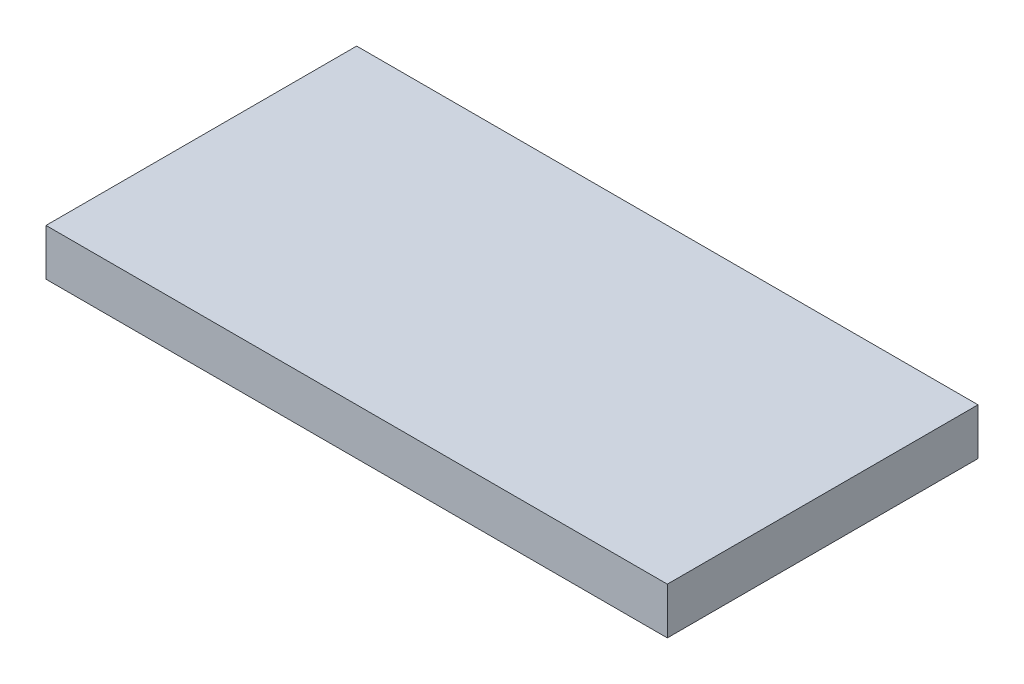
ISO-10303-21;
HEADER;
FILE_DESCRIPTION(('STEP AP214'),'2;1');
FILE_NAME('part.step','',(''),(''),'','','');
FILE_SCHEMA(('AUTOMOTIVE_DESIGN { 1 0 10303 214 1 1 1 1 }'));
ENDSEC;
DATA;
#1=APPLICATION_CONTEXT('core data for automotive mechanical design processes');
#2=APPLICATION_PROTOCOL_DEFINITION('international standard','automotive_design',2000,#1);
#3=PRODUCT_CONTEXT('',#1,'mechanical');
#4=PRODUCT('Part','Part','',(#3));
#5=PRODUCT_RELATED_PRODUCT_CATEGORY('part','',(#4));
#6=PRODUCT_DEFINITION_FORMATION('','',#4);
#7=PRODUCT_DEFINITION_CONTEXT('part definition',#1,'design');
#8=PRODUCT_DEFINITION('design','',#6,#7);
#9=PRODUCT_DEFINITION_SHAPE('','',#8);
#10=(LENGTH_UNIT() NAMED_UNIT(*) SI_UNIT(.MILLI.,.METRE.));
#11=(NAMED_UNIT(*) PLANE_ANGLE_UNIT() SI_UNIT($,.RADIAN.));
#12=(NAMED_UNIT(*) SI_UNIT($,.STERADIAN.) SOLID_ANGLE_UNIT());
#13=UNCERTAINTY_MEASURE_WITH_UNIT(LENGTH_MEASURE(1.E-05),#10,'distance_accuracy_value','');
#14=(GEOMETRIC_REPRESENTATION_CONTEXT(3) GLOBAL_UNCERTAINTY_ASSIGNED_CONTEXT((#13)) GLOBAL_UNIT_ASSIGNED_CONTEXT((#10,
#11,#12)) REPRESENTATION_CONTEXT('',''));
#15=CARTESIAN_POINT('',(0.,0.,0.));
#16=DIRECTION('',(0.,0.,1.));
#17=DIRECTION('',(1.,0.,0.));
#18=AXIS2_PLACEMENT_3D('',#15,#16,#17);
#19=CARTESIAN_POINT('',(40.,6.,20.));
#20=DIRECTION('',(-1.,0.,0.));
#21=DIRECTION('',(0.,0.,1.));
#22=AXIS2_PLACEMENT_3D('',#19,#20,#21);
#23=PLANE('',#22);
#24=DIRECTION('',(0.,0.,-1.));
#25=VECTOR('',#24,1.);
#26=CARTESIAN_POINT('',(40.,0.,20.));
#27=LINE('',#26,#25);
#28=CARTESIAN_POINT('',(40.,0.,20.));
#29=VERTEX_POINT('',#28);
#30=CARTESIAN_POINT('',(40.,0.,-20.));
#31=VERTEX_POINT('',#30);
#32=EDGE_CURVE('E96',#29,#31,#27,.T.);
#33=ORIENTED_EDGE('',*,*,#32,.T.);
#34=DIRECTION('',(0.,-1.,0.));
#35=VECTOR('',#34,1.);
#36=CARTESIAN_POINT('',(40.,6.,-20.));
#37=LINE('',#36,#35);
#38=CARTESIAN_POINT('',(40.,6.,-20.));
#39=VERTEX_POINT('',#38);
#40=EDGE_CURVE('E11',#39,#31,#37,.T.);
#41=ORIENTED_EDGE('',*,*,#40,.F.);
#42=DIRECTION('',(0.,0.,-1.));
#43=VECTOR('',#42,1.);
#44=CARTESIAN_POINT('',(40.,6.,20.));
#45=LINE('',#44,#43);
#46=CARTESIAN_POINT('',(40.,6.,20.));
#47=VERTEX_POINT('',#46);
#48=EDGE_CURVE('E84',#47,#39,#45,.T.);
#49=ORIENTED_EDGE('',*,*,#48,.F.);
#50=DIRECTION('',(0.,-1.,0.));
#51=VECTOR('',#50,1.);
#52=CARTESIAN_POINT('',(40.,6.,20.));
#53=LINE('',#52,#51);
#54=EDGE_CURVE('E92',#47,#29,#53,.T.);
#55=ORIENTED_EDGE('',*,*,#54,.T.);
#56=EDGE_LOOP('',(#33,#41,#49,#55));
#57=FACE_BOUND('',#56,.T.);
#58=ADVANCED_FACE('F33',(#57),#23,.F.);
#59=CARTESIAN_POINT('',(-40.,6.,-20.));
#60=DIRECTION('',(0.,0.,1.));
#61=DIRECTION('',(1.,0.,0.));
#62=AXIS2_PLACEMENT_3D('',#59,#60,#61);
#63=PLANE('',#62);
#64=DIRECTION('',(-1.,0.,0.));
#65=VECTOR('',#64,1.);
#66=CARTESIAN_POINT('',(-40.,0.,-20.));
#67=LINE('',#66,#65);
#68=CARTESIAN_POINT('',(-40.,0.,-20.));
#69=VERTEX_POINT('',#68);
#70=EDGE_CURVE('E88',#31,#69,#67,.T.);
#71=ORIENTED_EDGE('',*,*,#70,.T.);
#72=DIRECTION('',(0.,-1.,0.));
#73=VECTOR('',#72,1.);
#74=CARTESIAN_POINT('',(-40.,6.,-20.));
#75=LINE('',#74,#73);
#76=CARTESIAN_POINT('',(-40.,6.,-20.));
#77=VERTEX_POINT('',#76);
#78=EDGE_CURVE('E41',#77,#69,#75,.T.);
#79=ORIENTED_EDGE('',*,*,#78,.F.);
#80=DIRECTION('',(-1.,0.,0.));
#81=VECTOR('',#80,1.);
#82=CARTESIAN_POINT('',(-40.,6.,-20.));
#83=LINE('',#82,#81);
#84=EDGE_CURVE('E79',#39,#77,#83,.T.);
#85=ORIENTED_EDGE('',*,*,#84,.F.);
#86=ORIENTED_EDGE('',*,*,#40,.T.);
#87=EDGE_LOOP('',(#71,#79,#85,#86));
#88=FACE_BOUND('',#87,.T.);
#89=ADVANCED_FACE('F87',(#88),#63,.F.);
#90=CARTESIAN_POINT('',(-40.,6.,20.));
#91=DIRECTION('',(1.,0.,0.));
#92=DIRECTION('',(0.,0.,-1.));
#93=AXIS2_PLACEMENT_3D('',#90,#91,#92);
#94=PLANE('',#93);
#95=DIRECTION('',(0.,0.,1.));
#96=VECTOR('',#95,1.);
#97=CARTESIAN_POINT('',(-40.,0.,20.));
#98=LINE('',#97,#96);
#99=CARTESIAN_POINT('',(-40.,0.,20.));
#100=VERTEX_POINT('',#99);
#101=EDGE_CURVE('E66',#69,#100,#98,.T.);
#102=ORIENTED_EDGE('',*,*,#101,.T.);
#103=DIRECTION('',(0.,-1.,0.));
#104=VECTOR('',#103,1.);
#105=CARTESIAN_POINT('',(-40.,6.,20.));
#106=LINE('',#105,#104);
#107=CARTESIAN_POINT('',(-40.,6.,20.));
#108=VERTEX_POINT('',#107);
#109=EDGE_CURVE('E89',#108,#100,#106,.T.);
#110=ORIENTED_EDGE('',*,*,#109,.F.);
#111=DIRECTION('',(0.,0.,1.));
#112=VECTOR('',#111,1.);
#113=CARTESIAN_POINT('',(-40.,6.,20.));
#114=LINE('',#113,#112);
#115=EDGE_CURVE('E82',#77,#108,#114,.T.);
#116=ORIENTED_EDGE('',*,*,#115,.F.);
#117=ORIENTED_EDGE('',*,*,#78,.T.);
#118=EDGE_LOOP('',(#102,#110,#116,#117));
#119=FACE_BOUND('',#118,.T.);
#120=ADVANCED_FACE('F90',(#119),#94,.F.);
#121=CARTESIAN_POINT('',(-40.,6.,20.));
#122=DIRECTION('',(0.,0.,-1.));
#123=DIRECTION('',(-1.,0.,0.));
#124=AXIS2_PLACEMENT_3D('',#121,#122,#123);
#125=PLANE('',#124);
#126=DIRECTION('',(1.,0.,0.));
#127=VECTOR('',#126,1.);
#128=CARTESIAN_POINT('',(-40.,0.,20.));
#129=LINE('',#128,#127);
#130=EDGE_CURVE('E72',#100,#29,#129,.T.);
#131=ORIENTED_EDGE('',*,*,#130,.T.);
#132=ORIENTED_EDGE('',*,*,#54,.F.);
#133=DIRECTION('',(1.,0.,0.));
#134=VECTOR('',#133,1.);
#135=CARTESIAN_POINT('',(-40.,6.,20.));
#136=LINE('',#135,#134);
#137=EDGE_CURVE('E49',#108,#47,#136,.T.);
#138=ORIENTED_EDGE('',*,*,#137,.F.);
#139=ORIENTED_EDGE('',*,*,#109,.T.);
#140=EDGE_LOOP('',(#131,#132,#138,#139));
#141=FACE_BOUND('',#140,.T.);
#142=ADVANCED_FACE('F103',(#141),#125,.F.);
#143=CARTESIAN_POINT('',(0.,6.,0.));
#144=DIRECTION('',(0.,-1.,0.));
#145=DIRECTION('',(0.,0.,-1.));
#146=AXIS2_PLACEMENT_3D('',#143,#144,#145);
#147=PLANE('',#146);
#148=ORIENTED_EDGE('',*,*,#48,.T.);
#149=ORIENTED_EDGE('',*,*,#84,.T.);
#150=ORIENTED_EDGE('',*,*,#115,.T.);
#151=ORIENTED_EDGE('',*,*,#137,.T.);
#152=EDGE_LOOP('',(#148,#149,#150,#151));
#153=FACE_BOUND('',#152,.T.);
#154=ADVANCED_FACE('F80',(#153),#147,.F.);
#155=CARTESIAN_POINT('',(0.,0.,0.));
#156=DIRECTION('',(0.,-1.,0.));
#157=DIRECTION('',(0.,0.,-1.));
#158=AXIS2_PLACEMENT_3D('',#155,#156,#157);
#159=PLANE('',#158);
#160=ORIENTED_EDGE('',*,*,#32,.F.);
#161=ORIENTED_EDGE('',*,*,#130,.F.);
#162=ORIENTED_EDGE('',*,*,#101,.F.);
#163=ORIENTED_EDGE('',*,*,#70,.F.);
#164=EDGE_LOOP('',(#160,#161,#162,#163));
#165=FACE_BOUND('',#164,.T.);
#166=ADVANCED_FACE('F106',(#165),#159,.T.);
#167=CLOSED_SHELL('',(#58,#89,#120,#142,#154,#166));
#168=MANIFOLD_SOLID_BREP('B2',#167);
#169=ADVANCED_BREP_SHAPE_REPRESENTATION('',(#18,#168),#14);
#170=SHAPE_DEFINITION_REPRESENTATION(#9,#169);
ENDSEC;
END-ISO-10303-21;
